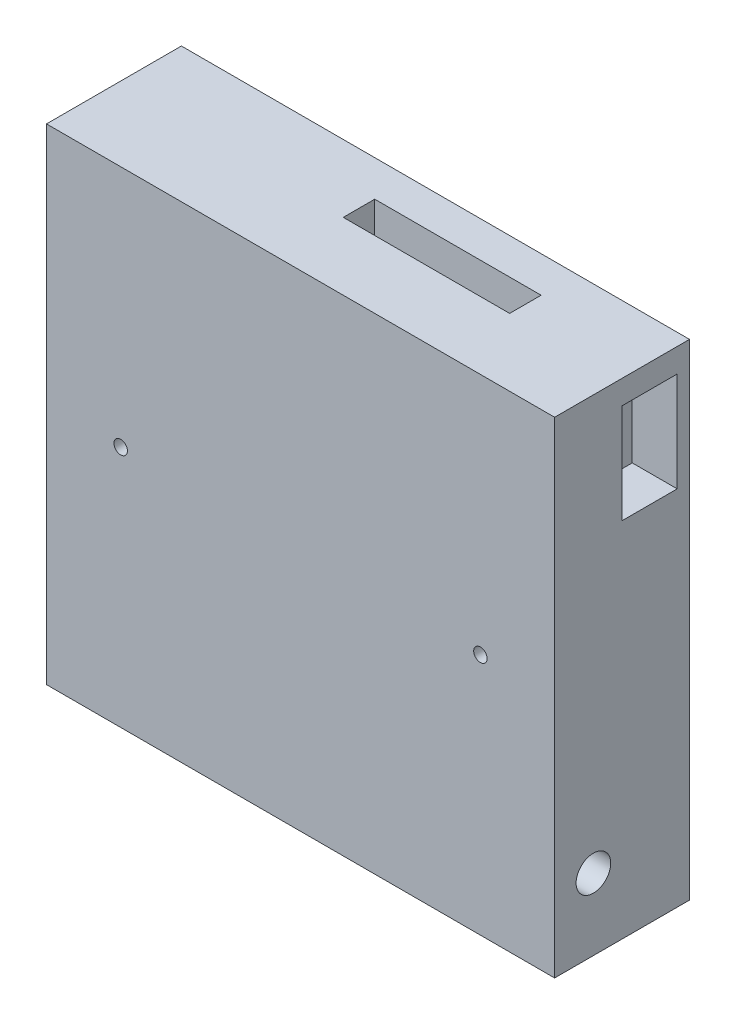
ISO-10303-21;
HEADER;
FILE_DESCRIPTION(('STEP AP214'),'2;1');
FILE_NAME('part.step','',(''),(''),'','','');
FILE_SCHEMA(('AUTOMOTIVE_DESIGN { 1 0 10303 214 1 1 1 1 }'));
ENDSEC;
DATA;
#1=APPLICATION_CONTEXT('core data for automotive mechanical design processes');
#2=APPLICATION_PROTOCOL_DEFINITION('international standard','automotive_design',2000,#1);
#3=PRODUCT_CONTEXT('',#1,'mechanical');
#4=PRODUCT('Part','Part','',(#3));
#5=PRODUCT_RELATED_PRODUCT_CATEGORY('part','',(#4));
#6=PRODUCT_DEFINITION_FORMATION('','',#4);
#7=PRODUCT_DEFINITION_CONTEXT('part definition',#1,'design');
#8=PRODUCT_DEFINITION('design','',#6,#7);
#9=PRODUCT_DEFINITION_SHAPE('','',#8);
#10=(LENGTH_UNIT() NAMED_UNIT(*) SI_UNIT(.MILLI.,.METRE.));
#11=(NAMED_UNIT(*) PLANE_ANGLE_UNIT() SI_UNIT($,.RADIAN.));
#12=(NAMED_UNIT(*) SI_UNIT($,.STERADIAN.) SOLID_ANGLE_UNIT());
#13=UNCERTAINTY_MEASURE_WITH_UNIT(LENGTH_MEASURE(1.E-05),#10,'distance_accuracy_value','');
#14=(GEOMETRIC_REPRESENTATION_CONTEXT(3) GLOBAL_UNCERTAINTY_ASSIGNED_CONTEXT((#13)) GLOBAL_UNIT_ASSIGNED_CONTEXT((#10,
#11,#12)) REPRESENTATION_CONTEXT('',''));
#15=CARTESIAN_POINT('',(0.,0.,0.));
#16=DIRECTION('',(0.,0.,1.));
#17=DIRECTION('',(1.,0.,0.));
#18=AXIS2_PLACEMENT_3D('',#15,#16,#17);
#19=CARTESIAN_POINT('',(0.,0.,-15.));
#20=DIRECTION('',(0.,0.,1.));
#21=DIRECTION('',(1.,0.,0.));
#22=AXIS2_PLACEMENT_3D('',#19,#20,#21);
#23=PLANE('',#22);
#24=CARTESIAN_POINT('',(40.5,-38.,-15.));
#25=DIRECTION('',(0.,0.,-1.));
#26=DIRECTION('',(-1.,0.,0.));
#27=AXIS2_PLACEMENT_3D('',#24,#25,#26);
#28=CIRCLE('',#27,5.);
#29=CARTESIAN_POINT('',(35.5,-38.,-15.));
#30=VERTEX_POINT('',#29);
#31=EDGE_CURVE('E20',#30,#30,#28,.F.);
#32=ORIENTED_EDGE('',*,*,#31,.F.);
#33=EDGE_LOOP('',(#32));
#34=FACE_BOUND('',#33,.T.);
#35=ADVANCED_FACE('F17',(#34),#23,.F.);
#36=CARTESIAN_POINT('',(40.5,-38.,-13.));
#37=DIRECTION('',(0.,0.,-1.));
#38=DIRECTION('',(-1.,0.,0.));
#39=AXIS2_PLACEMENT_3D('',#36,#37,#38);
#40=CYLINDRICAL_SURFACE('',#39,5.);
#41=CARTESIAN_POINT('',(40.5,-38.,-13.));
#42=DIRECTION('',(0.,0.,-1.));
#43=DIRECTION('',(-1.,0.,0.));
#44=AXIS2_PLACEMENT_3D('',#41,#42,#43);
#45=CIRCLE('',#44,5.);
#46=CARTESIAN_POINT('',(35.5,-38.,-13.));
#47=VERTEX_POINT('',#46);
#48=EDGE_CURVE('E181',#47,#47,#45,.F.);
#49=ORIENTED_EDGE('',*,*,#48,.F.);
#50=EDGE_LOOP('',(#49));
#51=FACE_BOUND('',#50,.T.);
#52=ORIENTED_EDGE('',*,*,#31,.T.);
#53=EDGE_LOOP('',(#52));
#54=FACE_BOUND('',#53,.T.);
#55=ADVANCED_FACE('F188',(#51,#54),#40,.T.);
#56=CARTESIAN_POINT('',(40.5,-38.,-13.));
#57=DIRECTION('',(0.,0.,-1.));
#58=DIRECTION('',(-1.,0.,0.));
#59=AXIS2_PLACEMENT_3D('',#56,#57,#58);
#60=PLANE('',#59);
#61=CARTESIAN_POINT('',(40.5,-38.,-13.));
#62=DIRECTION('',(0.,0.,-1.));
#63=DIRECTION('',(-1.,0.,0.));
#64=AXIS2_PLACEMENT_3D('',#61,#62,#63);
#65=CIRCLE('',#64,6.);
#66=CARTESIAN_POINT('',(34.5,-38.,-13.));
#67=VERTEX_POINT('',#66);
#68=EDGE_CURVE('E179',#67,#67,#65,.T.);
#69=ORIENTED_EDGE('',*,*,#68,.T.);
#70=EDGE_LOOP('',(#69));
#71=FACE_BOUND('',#70,.T.);
#72=ORIENTED_EDGE('',*,*,#48,.T.);
#73=EDGE_LOOP('',(#72));
#74=FACE_BOUND('',#73,.T.);
#75=ADVANCED_FACE('F195',(#71,#74),#60,.T.);
#76=CARTESIAN_POINT('',(46.5,-38.1179725269454,6.37303641617704));
#77=DIRECTION('',(1.,0.,0.));
#78=DIRECTION('',(0.,1.,0.));
#79=AXIS2_PLACEMENT_3D('',#76,#77,#78);
#80=PLANE('',#79);
#81=CARTESIAN_POINT('',(46.5,-38.1179725269454,6.37303641617704));
#82=DIRECTION('',(1.,0.,0.));
#83=DIRECTION('',(0.,1.,0.));
#84=AXIS2_PLACEMENT_3D('',#81,#82,#83);
#85=CIRCLE('',#84,3.84787104372952);
#86=CARTESIAN_POINT('',(46.5,-34.2701014832159,6.37303641617704));
#87=VERTEX_POINT('',#86);
#88=EDGE_CURVE('E138',#87,#87,#85,.T.);
#89=ORIENTED_EDGE('',*,*,#88,.T.);
#90=EDGE_LOOP('',(#89));
#91=FACE_BOUND('',#90,.T.);
#92=ADVANCED_FACE('F303',(#91),#80,.T.);
#93=CARTESIAN_POINT('',(46.5,0.,0.));
#94=DIRECTION('',(1.,0.,0.));
#95=DIRECTION('',(0.,0.,-1.));
#96=AXIS2_PLACEMENT_3D('',#93,#94,#95);
#97=PLANE('',#96);
#98=DIRECTION('',(0.,1.,0.));
#99=VECTOR('',#98,1.);
#100=CARTESIAN_POINT('',(46.5,26.5743593957575,-12.2650889518879));
#101=LINE('',#100,#99);
#102=CARTESIAN_POINT('',(46.5,26.5743593957575,-12.2650889518879));
#103=VERTEX_POINT('',#102);
#104=CARTESIAN_POINT('',(46.5,48.6996178972024,-12.2650889518879));
#105=VERTEX_POINT('',#104);
#106=EDGE_CURVE('E130',#103,#105,#101,.T.);
#107=ORIENTED_EDGE('',*,*,#106,.T.);
#108=DIRECTION('',(0.,0.,1.));
#109=VECTOR('',#108,1.);
#110=CARTESIAN_POINT('',(46.5,48.6996178972024,-12.2650889518879));
#111=LINE('',#110,#109);
#112=CARTESIAN_POINT('',(46.5,48.6996178972024,0.));
#113=VERTEX_POINT('',#112);
#114=EDGE_CURVE('E127',#105,#113,#111,.T.);
#115=ORIENTED_EDGE('',*,*,#114,.T.);
#116=DIRECTION('',(0.,1.,0.));
#117=VECTOR('',#116,1.);
#118=CARTESIAN_POINT('',(46.5,26.5743593957575,0.));
#119=LINE('',#118,#117);
#120=CARTESIAN_POINT('',(46.5,26.5743593957575,0.));
#121=VERTEX_POINT('',#120);
#122=EDGE_CURVE('E152',#113,#121,#119,.F.);
#123=ORIENTED_EDGE('',*,*,#122,.T.);
#124=DIRECTION('',(0.,0.,1.));
#125=VECTOR('',#124,1.);
#126=CARTESIAN_POINT('',(46.5,26.5743593957575,-12.2650889518879));
#127=LINE('',#126,#125);
#128=EDGE_CURVE('E134',#121,#103,#127,.F.);
#129=ORIENTED_EDGE('',*,*,#128,.T.);
#130=EDGE_LOOP('',(#107,#115,#123,#129));
#131=FACE_BOUND('',#130,.T.);
#132=ADVANCED_FACE('F132',(#131),#97,.T.);
#133=CARTESIAN_POINT('',(0.,44.,0.));
#134=DIRECTION('',(0.,-1.,0.));
#135=DIRECTION('',(0.,0.,-1.));
#136=AXIS2_PLACEMENT_3D('',#133,#134,#135);
#137=PLANE('',#136);
#138=DIRECTION('',(1.,0.,0.));
#139=VECTOR('',#138,1.);
#140=CARTESIAN_POINT('',(31.5,44.,0.));
#141=LINE('',#140,#139);
#142=CARTESIAN_POINT('',(-5.49999999999999,44.,0.));
#143=VERTEX_POINT('',#142);
#144=CARTESIAN_POINT('',(31.5,44.,0.));
#145=VERTEX_POINT('',#144);
#146=EDGE_CURVE('E536',#143,#145,#141,.T.);
#147=ORIENTED_EDGE('',*,*,#146,.T.);
#148=DIRECTION('',(0.,0.,1.));
#149=VECTOR('',#148,1.);
#150=CARTESIAN_POINT('',(31.5,44.,-7.));
#151=LINE('',#150,#149);
#152=CARTESIAN_POINT('',(31.5,44.,-7.));
#153=VERTEX_POINT('',#152);
#154=EDGE_CURVE('E538',#145,#153,#151,.F.);
#155=ORIENTED_EDGE('',*,*,#154,.T.);
#156=DIRECTION('',(-1.,0.,0.));
#157=VECTOR('',#156,1.);
#158=CARTESIAN_POINT('',(-5.49999999999999,44.,-7.));
#159=LINE('',#158,#157);
#160=CARTESIAN_POINT('',(-5.49999999999999,44.,-7.));
#161=VERTEX_POINT('',#160);
#162=EDGE_CURVE('E568',#153,#161,#159,.T.);
#163=ORIENTED_EDGE('',*,*,#162,.T.);
#164=DIRECTION('',(0.,0.,1.));
#165=VECTOR('',#164,1.);
#166=CARTESIAN_POINT('',(-5.49999999999999,44.,0.));
#167=LINE('',#166,#165);
#168=EDGE_CURVE('E541',#161,#143,#167,.T.);
#169=ORIENTED_EDGE('',*,*,#168,.T.);
#170=EDGE_LOOP('',(#147,#155,#163,#169));
#171=FACE_BOUND('',#170,.T.);
#172=ADVANCED_FACE('F296',(#171),#137,.F.);
#173=CARTESIAN_POINT('',(-46.5,0.,0.));
#174=DIRECTION('',(-1.,0.,0.));
#175=DIRECTION('',(0.,-1.,0.));
#176=AXIS2_PLACEMENT_3D('',#173,#174,#175);
#177=PLANE('',#176);
#178=DIRECTION('',(0.,-1.,0.));
#179=VECTOR('',#178,1.);
#180=CARTESIAN_POINT('',(-46.5,-45.,7.5));
#181=LINE('',#180,#179);
#182=CARTESIAN_POINT('',(-46.5,-45.,7.5));
#183=VERTEX_POINT('',#182);
#184=CARTESIAN_POINT('',(-46.5,45.,7.5));
#185=VERTEX_POINT('',#184);
#186=EDGE_CURVE('E557',#183,#185,#181,.F.);
#187=ORIENTED_EDGE('',*,*,#186,.T.);
#188=DIRECTION('',(0.,0.,1.));
#189=VECTOR('',#188,1.);
#190=CARTESIAN_POINT('',(-46.5,45.,7.5));
#191=LINE('',#190,#189);
#192=CARTESIAN_POINT('',(-46.5,45.,-7.5));
#193=VERTEX_POINT('',#192);
#194=EDGE_CURVE('E600',#185,#193,#191,.F.);
#195=ORIENTED_EDGE('',*,*,#194,.T.);
#196=DIRECTION('',(0.,1.,0.));
#197=VECTOR('',#196,1.);
#198=CARTESIAN_POINT('',(-46.5,-45.,-7.5));
#199=LINE('',#198,#197);
#200=CARTESIAN_POINT('',(-46.5,-45.,-7.5));
#201=VERTEX_POINT('',#200);
#202=EDGE_CURVE('E595',#193,#201,#199,.F.);
#203=ORIENTED_EDGE('',*,*,#202,.T.);
#204=DIRECTION('',(0.,0.,1.));
#205=VECTOR('',#204,1.);
#206=CARTESIAN_POINT('',(-46.5,-45.,7.5));
#207=LINE('',#206,#205);
#208=EDGE_CURVE('E590',#201,#183,#207,.T.);
#209=ORIENTED_EDGE('',*,*,#208,.T.);
#210=EDGE_LOOP('',(#187,#195,#203,#209));
#211=FACE_BOUND('',#210,.T.);
#212=ADVANCED_FACE('F292',(#211),#177,.T.);
#213=CARTESIAN_POINT('',(40.5,-38.,-13.));
#214=DIRECTION('',(0.,0.,-1.));
#215=DIRECTION('',(-1.,0.,0.));
#216=AXIS2_PLACEMENT_3D('',#213,#214,#215);
#217=CYLINDRICAL_SURFACE('',#216,6.);
#218=ORIENTED_EDGE('',*,*,#68,.F.);
#219=EDGE_LOOP('',(#218));
#220=FACE_BOUND('',#219,.T.);
#221=CARTESIAN_POINT('',(40.5,-38.,-15.));
#222=DIRECTION('',(0.,0.,-1.));
#223=DIRECTION('',(-1.,0.,0.));
#224=AXIS2_PLACEMENT_3D('',#221,#222,#223);
#225=CIRCLE('',#224,6.);
#226=CARTESIAN_POINT('',(34.5,-38.,-15.));
#227=VERTEX_POINT('',#226);
#228=EDGE_CURVE('E173',#227,#227,#225,.T.);
#229=ORIENTED_EDGE('',*,*,#228,.T.);
#230=EDGE_LOOP('',(#229));
#231=FACE_BOUND('',#230,.T.);
#232=ADVANCED_FACE('F288',(#220,#231),#217,.F.);
#233=CARTESIAN_POINT('',(40.,0.,5.));
#234=DIRECTION('',(0.,0.,1.));
#235=DIRECTION('',(1.,0.,0.));
#236=AXIS2_PLACEMENT_3D('',#233,#234,#235);
#237=PLANE('',#236);
#238=CARTESIAN_POINT('',(40.,0.,5.));
#239=DIRECTION('',(0.,0.,1.));
#240=DIRECTION('',(1.,0.,0.));
#241=AXIS2_PLACEMENT_3D('',#238,#239,#240);
#242=CIRCLE('',#241,1.5);
#243=CARTESIAN_POINT('',(41.5,0.,5.));
#244=VERTEX_POINT('',#243);
#245=EDGE_CURVE('E170',#244,#244,#242,.T.);
#246=ORIENTED_EDGE('',*,*,#245,.T.);
#247=EDGE_LOOP('',(#246));
#248=FACE_BOUND('',#247,.T.);
#249=ADVANCED_FACE('F284',(#248),#237,.T.);
#250=CARTESIAN_POINT('',(-40.,0.,5.));
#251=DIRECTION('',(0.,0.,1.));
#252=DIRECTION('',(1.,0.,0.));
#253=AXIS2_PLACEMENT_3D('',#250,#251,#252);
#254=PLANE('',#253);
#255=CARTESIAN_POINT('',(-40.,0.,5.));
#256=DIRECTION('',(0.,0.,1.));
#257=DIRECTION('',(1.,0.,0.));
#258=AXIS2_PLACEMENT_3D('',#255,#256,#257);
#259=CIRCLE('',#258,1.5);
#260=CARTESIAN_POINT('',(-38.5,0.,5.));
#261=VERTEX_POINT('',#260);
#262=EDGE_CURVE('E167',#261,#261,#259,.T.);
#263=ORIENTED_EDGE('',*,*,#262,.T.);
#264=EDGE_LOOP('',(#263));
#265=FACE_BOUND('',#264,.T.);
#266=ADVANCED_FACE('F280',(#265),#254,.T.);
#267=CARTESIAN_POINT('',(46.5,-38.1179725269454,6.37303641617704));
#268=DIRECTION('',(1.,0.,0.));
#269=DIRECTION('',(0.,1.,0.));
#270=AXIS2_PLACEMENT_3D('',#267,#268,#269);
#271=CYLINDRICAL_SURFACE('',#270,3.84787104372952);
#272=ORIENTED_EDGE('',*,*,#88,.F.);
#273=EDGE_LOOP('',(#272));
#274=FACE_BOUND('',#273,.T.);
#275=CARTESIAN_POINT('',(56.5,-38.1179725269454,6.37303641617704));
#276=DIRECTION('',(1.,0.,0.));
#277=DIRECTION('',(0.,1.,0.));
#278=AXIS2_PLACEMENT_3D('',#275,#276,#277);
#279=CIRCLE('',#278,3.84787104372952);
#280=CARTESIAN_POINT('',(56.5,-34.2701014832159,6.37303641617704));
#281=VERTEX_POINT('',#280);
#282=EDGE_CURVE('E164',#281,#281,#279,.T.);
#283=ORIENTED_EDGE('',*,*,#282,.T.);
#284=EDGE_LOOP('',(#283));
#285=FACE_BOUND('',#284,.T.);
#286=ADVANCED_FACE('F277',(#274,#285),#271,.F.);
#287=CARTESIAN_POINT('',(46.5,26.5743593957575,-12.2650889518879));
#288=DIRECTION('',(0.,0.,-1.));
#289=DIRECTION('',(-1.,0.,0.));
#290=AXIS2_PLACEMENT_3D('',#287,#288,#289);
#291=PLANE('',#290);
#292=DIRECTION('',(-1.,0.,0.));
#293=VECTOR('',#292,1.);
#294=CARTESIAN_POINT('',(46.5,48.6996178972024,-12.2650889518879));
#295=LINE('',#294,#293);
#296=CARTESIAN_POINT('',(56.5,48.6996178972024,-12.2650889518879));
#297=VERTEX_POINT('',#296);
#298=EDGE_CURVE('E137',#297,#105,#295,.T.);
#299=ORIENTED_EDGE('',*,*,#298,.T.);
#300=ORIENTED_EDGE('',*,*,#106,.F.);
#301=DIRECTION('',(1.,0.,0.));
#302=VECTOR('',#301,1.);
#303=CARTESIAN_POINT('',(46.5,26.5743593957575,-12.2650889518879));
#304=LINE('',#303,#302);
#305=CARTESIAN_POINT('',(56.5,26.5743593957575,-12.2650889518879));
#306=VERTEX_POINT('',#305);
#307=EDGE_CURVE('E552',#103,#306,#304,.T.);
#308=ORIENTED_EDGE('',*,*,#307,.T.);
#309=DIRECTION('',(0.,-1.,0.));
#310=VECTOR('',#309,1.);
#311=CARTESIAN_POINT('',(56.5,54.,-12.2650889518879));
#312=LINE('',#311,#310);
#313=EDGE_CURVE('E143',#306,#297,#312,.F.);
#314=ORIENTED_EDGE('',*,*,#313,.T.);
#315=EDGE_LOOP('',(#299,#300,#308,#314));
#316=FACE_BOUND('',#315,.T.);
#317=ADVANCED_FACE('F141',(#316),#291,.F.);
#318=CARTESIAN_POINT('',(46.5,48.6996178972024,-12.2650889518879));
#319=DIRECTION('',(0.,1.,0.));
#320=DIRECTION('',(-1.,0.,0.));
#321=AXIS2_PLACEMENT_3D('',#318,#319,#320);
#322=PLANE('',#321);
#323=DIRECTION('',(1.,0.,0.));
#324=VECTOR('',#323,1.);
#325=CARTESIAN_POINT('',(46.5,48.6996178972024,0.));
#326=LINE('',#325,#324);
#327=CARTESIAN_POINT('',(56.5,48.6996178972024,0.));
#328=VERTEX_POINT('',#327);
#329=EDGE_CURVE('E149',#328,#113,#326,.F.);
#330=ORIENTED_EDGE('',*,*,#329,.T.);
#331=ORIENTED_EDGE('',*,*,#114,.F.);
#332=ORIENTED_EDGE('',*,*,#298,.F.);
#333=DIRECTION('',(0.,0.,1.));
#334=VECTOR('',#333,1.);
#335=CARTESIAN_POINT('',(56.5,48.6996178972024,15.));
#336=LINE('',#335,#334);
#337=EDGE_CURVE('E584',#297,#328,#336,.T.);
#338=ORIENTED_EDGE('',*,*,#337,.T.);
#339=EDGE_LOOP('',(#330,#331,#332,#338));
#340=FACE_BOUND('',#339,.T.);
#341=ADVANCED_FACE('F147',(#340),#322,.F.);
#342=CARTESIAN_POINT('',(46.5,26.5743593957575,0.));
#343=DIRECTION('',(0.,0.,1.));
#344=DIRECTION('',(1.,0.,0.));
#345=AXIS2_PLACEMENT_3D('',#342,#343,#344);
#346=PLANE('',#345);
#347=DIRECTION('',(1.,0.,0.));
#348=VECTOR('',#347,1.);
#349=CARTESIAN_POINT('',(46.5,26.5743593957575,0.));
#350=LINE('',#349,#348);
#351=CARTESIAN_POINT('',(56.5,26.5743593957575,0.));
#352=VERTEX_POINT('',#351);
#353=EDGE_CURVE('E573',#352,#121,#350,.F.);
#354=ORIENTED_EDGE('',*,*,#353,.T.);
#355=ORIENTED_EDGE('',*,*,#122,.F.);
#356=ORIENTED_EDGE('',*,*,#329,.F.);
#357=DIRECTION('',(0.,-1.,0.));
#358=VECTOR('',#357,1.);
#359=CARTESIAN_POINT('',(56.5,54.,0.));
#360=LINE('',#359,#358);
#361=EDGE_CURVE('E577',#328,#352,#360,.T.);
#362=ORIENTED_EDGE('',*,*,#361,.T.);
#363=EDGE_LOOP('',(#354,#355,#356,#362));
#364=FACE_BOUND('',#363,.T.);
#365=ADVANCED_FACE('F268',(#364),#346,.F.);
#366=CARTESIAN_POINT('',(46.5,26.5743593957575,-12.2650889518879));
#367=DIRECTION('',(0.,-1.,0.));
#368=DIRECTION('',(1.,0.,0.));
#369=AXIS2_PLACEMENT_3D('',#366,#367,#368);
#370=PLANE('',#369);
#371=ORIENTED_EDGE('',*,*,#307,.F.);
#372=ORIENTED_EDGE('',*,*,#128,.F.);
#373=ORIENTED_EDGE('',*,*,#353,.F.);
#374=DIRECTION('',(0.,0.,1.));
#375=VECTOR('',#374,1.);
#376=CARTESIAN_POINT('',(56.5,26.5743593957575,15.));
#377=LINE('',#376,#375);
#378=EDGE_CURVE('E580',#352,#306,#377,.F.);
#379=ORIENTED_EDGE('',*,*,#378,.T.);
#380=EDGE_LOOP('',(#371,#372,#373,#379));
#381=FACE_BOUND('',#380,.T.);
#382=ADVANCED_FACE('F264',(#381),#370,.F.);
#383=CARTESIAN_POINT('',(31.5,44.,-7.));
#384=DIRECTION('',(1.,0.,0.));
#385=DIRECTION('',(0.,1.,0.));
#386=AXIS2_PLACEMENT_3D('',#383,#384,#385);
#387=PLANE('',#386);
#388=DIRECTION('',(0.,1.,0.));
#389=VECTOR('',#388,1.);
#390=CARTESIAN_POINT('',(31.5,44.,-7.));
#391=LINE('',#390,#389);
#392=CARTESIAN_POINT('',(31.5,54.,-7.));
#393=VERTEX_POINT('',#392);
#394=EDGE_CURVE('E550',#393,#153,#391,.F.);
#395=ORIENTED_EDGE('',*,*,#394,.T.);
#396=ORIENTED_EDGE('',*,*,#154,.F.);
#397=DIRECTION('',(0.,1.,0.));
#398=VECTOR('',#397,1.);
#399=CARTESIAN_POINT('',(31.5,44.,0.));
#400=LINE('',#399,#398);
#401=CARTESIAN_POINT('',(31.5,54.,0.));
#402=VERTEX_POINT('',#401);
#403=EDGE_CURVE('E545',#145,#402,#400,.T.);
#404=ORIENTED_EDGE('',*,*,#403,.T.);
#405=DIRECTION('',(0.,0.,1.));
#406=VECTOR('',#405,1.);
#407=CARTESIAN_POINT('',(31.5,54.,15.));
#408=LINE('',#407,#406);
#409=EDGE_CURVE('E636',#402,#393,#408,.F.);
#410=ORIENTED_EDGE('',*,*,#409,.T.);
#411=EDGE_LOOP('',(#395,#396,#404,#410));
#412=FACE_BOUND('',#411,.T.);
#413=ADVANCED_FACE('F260',(#412),#387,.F.);
#414=CARTESIAN_POINT('',(-5.49999999999999,44.,-7.));
#415=DIRECTION('',(0.,0.,-1.));
#416=DIRECTION('',(-1.,0.,0.));
#417=AXIS2_PLACEMENT_3D('',#414,#415,#416);
#418=PLANE('',#417);
#419=DIRECTION('',(0.,-1.,0.));
#420=VECTOR('',#419,1.);
#421=CARTESIAN_POINT('',(-5.49999999999999,44.,-7.));
#422=LINE('',#421,#420);
#423=CARTESIAN_POINT('',(-5.49999999999999,54.,-7.));
#424=VERTEX_POINT('',#423);
#425=EDGE_CURVE('E565',#424,#161,#422,.T.);
#426=ORIENTED_EDGE('',*,*,#425,.T.);
#427=ORIENTED_EDGE('',*,*,#162,.F.);
#428=ORIENTED_EDGE('',*,*,#394,.F.);
#429=DIRECTION('',(1.,0.,0.));
#430=VECTOR('',#429,1.);
#431=CARTESIAN_POINT('',(-56.5,54.,-7.));
#432=LINE('',#431,#430);
#433=EDGE_CURVE('E634',#393,#424,#432,.F.);
#434=ORIENTED_EDGE('',*,*,#433,.T.);
#435=EDGE_LOOP('',(#426,#427,#428,#434));
#436=FACE_BOUND('',#435,.T.);
#437=ADVANCED_FACE('F256',(#436),#418,.F.);
#438=CARTESIAN_POINT('',(-5.49999999999999,44.,0.));
#439=DIRECTION('',(-1.,0.,0.));
#440=DIRECTION('',(0.,-1.,0.));
#441=AXIS2_PLACEMENT_3D('',#438,#439,#440);
#442=PLANE('',#441);
#443=DIRECTION('',(0.,1.,0.));
#444=VECTOR('',#443,1.);
#445=CARTESIAN_POINT('',(-5.49999999999998,44.,0.));
#446=LINE('',#445,#444);
#447=CARTESIAN_POINT('',(-5.49999999999999,54.,0.));
#448=VERTEX_POINT('',#447);
#449=EDGE_CURVE('E546',#448,#143,#446,.F.);
#450=ORIENTED_EDGE('',*,*,#449,.T.);
#451=ORIENTED_EDGE('',*,*,#168,.F.);
#452=ORIENTED_EDGE('',*,*,#425,.F.);
#453=DIRECTION('',(0.,0.,1.));
#454=VECTOR('',#453,1.);
#455=CARTESIAN_POINT('',(-5.49999999999999,54.,15.));
#456=LINE('',#455,#454);
#457=EDGE_CURVE('E632',#424,#448,#456,.T.);
#458=ORIENTED_EDGE('',*,*,#457,.T.);
#459=EDGE_LOOP('',(#450,#451,#452,#458));
#460=FACE_BOUND('',#459,.T.);
#461=ADVANCED_FACE('F252',(#460),#442,.F.);
#462=CARTESIAN_POINT('',(31.5,44.,0.));
#463=DIRECTION('',(0.,0.,1.));
#464=DIRECTION('',(1.,0.,0.));
#465=AXIS2_PLACEMENT_3D('',#462,#463,#464);
#466=PLANE('',#465);
#467=ORIENTED_EDGE('',*,*,#403,.F.);
#468=ORIENTED_EDGE('',*,*,#146,.F.);
#469=ORIENTED_EDGE('',*,*,#449,.F.);
#470=DIRECTION('',(1.,0.,0.));
#471=VECTOR('',#470,1.);
#472=CARTESIAN_POINT('',(-56.5,54.,0.));
#473=LINE('',#472,#471);
#474=EDGE_CURVE('E555',#448,#402,#473,.T.);
#475=ORIENTED_EDGE('',*,*,#474,.T.);
#476=EDGE_LOOP('',(#467,#468,#469,#475));
#477=FACE_BOUND('',#476,.T.);
#478=ADVANCED_FACE('F248',(#477),#466,.F.);
#479=CARTESIAN_POINT('',(-46.5,-45.,7.5));
#480=DIRECTION('',(0.,0.,1.));
#481=DIRECTION('',(0.,-1.,0.));
#482=AXIS2_PLACEMENT_3D('',#479,#480,#481);
#483=PLANE('',#482);
#484=DIRECTION('',(1.,0.,0.));
#485=VECTOR('',#484,1.);
#486=CARTESIAN_POINT('',(-46.5,45.,7.5));
#487=LINE('',#486,#485);
#488=CARTESIAN_POINT('',(-56.5,45.,7.5));
#489=VERTEX_POINT('',#488);
#490=EDGE_CURVE('E559',#489,#185,#487,.T.);
#491=ORIENTED_EDGE('',*,*,#490,.T.);
#492=ORIENTED_EDGE('',*,*,#186,.F.);
#493=DIRECTION('',(1.,0.,0.));
#494=VECTOR('',#493,1.);
#495=CARTESIAN_POINT('',(-46.5,-45.,7.5));
#496=LINE('',#495,#494);
#497=CARTESIAN_POINT('',(-56.5,-45.,7.5));
#498=VERTEX_POINT('',#497);
#499=EDGE_CURVE('E176',#183,#498,#496,.F.);
#500=ORIENTED_EDGE('',*,*,#499,.T.);
#501=DIRECTION('',(0.,1.,0.));
#502=VECTOR('',#501,1.);
#503=CARTESIAN_POINT('',(-56.5,54.,7.5));
#504=LINE('',#503,#502);
#505=EDGE_CURVE('E607',#498,#489,#504,.T.);
#506=ORIENTED_EDGE('',*,*,#505,.T.);
#507=EDGE_LOOP('',(#491,#492,#500,#506));
#508=FACE_BOUND('',#507,.T.);
#509=ADVANCED_FACE('F244',(#508),#483,.F.);
#510=CARTESIAN_POINT('',(-46.5,45.,7.5));
#511=DIRECTION('',(0.,1.,0.));
#512=DIRECTION('',(0.,0.,1.));
#513=AXIS2_PLACEMENT_3D('',#510,#511,#512);
#514=PLANE('',#513);
#515=DIRECTION('',(-1.,0.,0.));
#516=VECTOR('',#515,1.);
#517=CARTESIAN_POINT('',(-46.5,45.,-7.5));
#518=LINE('',#517,#516);
#519=CARTESIAN_POINT('',(-56.5,45.,-7.5));
#520=VERTEX_POINT('',#519);
#521=EDGE_CURVE('E597',#520,#193,#518,.F.);
#522=ORIENTED_EDGE('',*,*,#521,.T.);
#523=ORIENTED_EDGE('',*,*,#194,.F.);
#524=ORIENTED_EDGE('',*,*,#490,.F.);
#525=DIRECTION('',(0.,0.,1.));
#526=VECTOR('',#525,1.);
#527=CARTESIAN_POINT('',(-56.5,45.,15.));
#528=LINE('',#527,#526);
#529=EDGE_CURVE('E621',#489,#520,#528,.F.);
#530=ORIENTED_EDGE('',*,*,#529,.T.);
#531=EDGE_LOOP('',(#522,#523,#524,#530));
#532=FACE_BOUND('',#531,.T.);
#533=ADVANCED_FACE('F240',(#532),#514,.F.);
#534=CARTESIAN_POINT('',(-46.5,-45.,-7.5));
#535=DIRECTION('',(0.,0.,-1.));
#536=DIRECTION('',(-1.,0.,0.));
#537=AXIS2_PLACEMENT_3D('',#534,#535,#536);
#538=PLANE('',#537);
#539=DIRECTION('',(1.,0.,0.));
#540=VECTOR('',#539,1.);
#541=CARTESIAN_POINT('',(-46.5,-45.,-7.5));
#542=LINE('',#541,#540);
#543=CARTESIAN_POINT('',(-56.5,-45.,-7.5));
#544=VERTEX_POINT('',#543);
#545=EDGE_CURVE('E592',#544,#201,#542,.T.);
#546=ORIENTED_EDGE('',*,*,#545,.T.);
#547=ORIENTED_EDGE('',*,*,#202,.F.);
#548=ORIENTED_EDGE('',*,*,#521,.F.);
#549=DIRECTION('',(0.,1.,0.));
#550=VECTOR('',#549,1.);
#551=CARTESIAN_POINT('',(-56.5,54.,-7.5));
#552=LINE('',#551,#550);
#553=EDGE_CURVE('E619',#520,#544,#552,.F.);
#554=ORIENTED_EDGE('',*,*,#553,.T.);
#555=EDGE_LOOP('',(#546,#547,#548,#554));
#556=FACE_BOUND('',#555,.T.);
#557=ADVANCED_FACE('F236',(#556),#538,.F.);
#558=CARTESIAN_POINT('',(-46.5,-45.,7.5));
#559=DIRECTION('',(0.,-1.,0.));
#560=DIRECTION('',(1.,0.,0.));
#561=AXIS2_PLACEMENT_3D('',#558,#559,#560);
#562=PLANE('',#561);
#563=ORIENTED_EDGE('',*,*,#499,.F.);
#564=ORIENTED_EDGE('',*,*,#208,.F.);
#565=ORIENTED_EDGE('',*,*,#545,.F.);
#566=DIRECTION('',(0.,0.,1.));
#567=VECTOR('',#566,1.);
#568=CARTESIAN_POINT('',(-56.5,-45.,15.));
#569=LINE('',#568,#567);
#570=EDGE_CURVE('E615',#544,#498,#569,.T.);
#571=ORIENTED_EDGE('',*,*,#570,.T.);
#572=EDGE_LOOP('',(#563,#564,#565,#571));
#573=FACE_BOUND('',#572,.T.);
#574=ADVANCED_FACE('F232',(#573),#562,.F.);
#575=CARTESIAN_POINT('',(0.,0.,-15.));
#576=DIRECTION('',(0.,0.,1.));
#577=DIRECTION('',(1.,0.,0.));
#578=AXIS2_PLACEMENT_3D('',#575,#576,#577);
#579=PLANE('',#578);
#580=DIRECTION('',(-1.,0.,0.));
#581=VECTOR('',#580,1.);
#582=CARTESIAN_POINT('',(-56.5,-54.,-15.));
#583=LINE('',#582,#581);
#584=CARTESIAN_POINT('',(56.5,-54.,-15.));
#585=VERTEX_POINT('',#584);
#586=CARTESIAN_POINT('',(-56.5,-54.,-15.));
#587=VERTEX_POINT('',#586);
#588=EDGE_CURVE('E163',#585,#587,#583,.T.);
#589=ORIENTED_EDGE('',*,*,#588,.T.);
#590=DIRECTION('',(0.,1.,0.));
#591=VECTOR('',#590,1.);
#592=CARTESIAN_POINT('',(-56.5,54.,-15.));
#593=LINE('',#592,#591);
#594=CARTESIAN_POINT('',(-56.5,54.,-15.));
#595=VERTEX_POINT('',#594);
#596=EDGE_CURVE('E652',#587,#595,#593,.T.);
#597=ORIENTED_EDGE('',*,*,#596,.T.);
#598=DIRECTION('',(1.,0.,0.));
#599=VECTOR('',#598,1.);
#600=CARTESIAN_POINT('',(-56.5,54.,-15.));
#601=LINE('',#600,#599);
#602=CARTESIAN_POINT('',(56.5,54.,-15.));
#603=VERTEX_POINT('',#602);
#604=EDGE_CURVE('E622',#595,#603,#601,.T.);
#605=ORIENTED_EDGE('',*,*,#604,.T.);
#606=DIRECTION('',(0.,-1.,0.));
#607=VECTOR('',#606,1.);
#608=CARTESIAN_POINT('',(56.5,54.,-15.));
#609=LINE('',#608,#607);
#610=EDGE_CURVE('E582',#603,#585,#609,.T.);
#611=ORIENTED_EDGE('',*,*,#610,.T.);
#612=EDGE_LOOP('',(#589,#597,#605,#611));
#613=FACE_BOUND('',#612,.T.);
#614=ORIENTED_EDGE('',*,*,#228,.F.);
#615=EDGE_LOOP('',(#614));
#616=FACE_BOUND('',#615,.T.);
#617=ADVANCED_FACE('F228',(#613,#616),#579,.F.);
#618=CARTESIAN_POINT('',(40.,0.,5.));
#619=DIRECTION('',(0.,0.,1.));
#620=DIRECTION('',(1.,0.,0.));
#621=AXIS2_PLACEMENT_3D('',#618,#619,#620);
#622=CYLINDRICAL_SURFACE('',#621,1.5);
#623=CARTESIAN_POINT('',(40.,0.,15.));
#624=DIRECTION('',(0.,0.,1.));
#625=DIRECTION('',(1.,0.,0.));
#626=AXIS2_PLACEMENT_3D('',#623,#624,#625);
#627=CIRCLE('',#626,1.5);
#628=CARTESIAN_POINT('',(41.5,0.,15.));
#629=VERTEX_POINT('',#628);
#630=EDGE_CURVE('E160',#629,#629,#627,.F.);
#631=ORIENTED_EDGE('',*,*,#630,.F.);
#632=EDGE_LOOP('',(#631));
#633=FACE_BOUND('',#632,.T.);
#634=ORIENTED_EDGE('',*,*,#245,.F.);
#635=EDGE_LOOP('',(#634));
#636=FACE_BOUND('',#635,.T.);
#637=ADVANCED_FACE('F224',(#633,#636),#622,.F.);
#638=CARTESIAN_POINT('',(-40.,0.,5.));
#639=DIRECTION('',(0.,0.,1.));
#640=DIRECTION('',(1.,0.,0.));
#641=AXIS2_PLACEMENT_3D('',#638,#639,#640);
#642=CYLINDRICAL_SURFACE('',#641,1.5);
#643=CARTESIAN_POINT('',(-40.,0.,15.));
#644=DIRECTION('',(0.,0.,1.));
#645=DIRECTION('',(1.,0.,0.));
#646=AXIS2_PLACEMENT_3D('',#643,#644,#645);
#647=CIRCLE('',#646,1.5);
#648=CARTESIAN_POINT('',(-38.5,0.,15.));
#649=VERTEX_POINT('',#648);
#650=EDGE_CURVE('E156',#649,#649,#647,.F.);
#651=ORIENTED_EDGE('',*,*,#650,.F.);
#652=EDGE_LOOP('',(#651));
#653=FACE_BOUND('',#652,.T.);
#654=ORIENTED_EDGE('',*,*,#262,.F.);
#655=EDGE_LOOP('',(#654));
#656=FACE_BOUND('',#655,.T.);
#657=ADVANCED_FACE('F220',(#653,#656),#642,.F.);
#658=CARTESIAN_POINT('',(56.5,54.,15.));
#659=DIRECTION('',(-1.,0.,0.));
#660=DIRECTION('',(0.,-1.,0.));
#661=AXIS2_PLACEMENT_3D('',#658,#659,#660);
#662=PLANE('',#661);
#663=DIRECTION('',(0.,0.,1.));
#664=VECTOR('',#663,1.);
#665=CARTESIAN_POINT('',(56.5,54.,15.));
#666=LINE('',#665,#664);
#667=CARTESIAN_POINT('',(56.5,54.,15.));
#668=VERTEX_POINT('',#667);
#669=EDGE_CURVE('E626',#603,#668,#666,.T.);
#670=ORIENTED_EDGE('',*,*,#669,.T.);
#671=DIRECTION('',(0.,1.,0.));
#672=VECTOR('',#671,1.);
#673=CARTESIAN_POINT('',(56.5,0.,15.));
#674=LINE('',#673,#672);
#675=CARTESIAN_POINT('',(56.5,-54.,15.));
#676=VERTEX_POINT('',#675);
#677=EDGE_CURVE('E159',#676,#668,#674,.T.);
#678=ORIENTED_EDGE('',*,*,#677,.F.);
#679=DIRECTION('',(0.,0.,1.));
#680=VECTOR('',#679,1.);
#681=CARTESIAN_POINT('',(56.5,-54.,15.));
#682=LINE('',#681,#680);
#683=EDGE_CURVE('E644',#676,#585,#682,.F.);
#684=ORIENTED_EDGE('',*,*,#683,.T.);
#685=ORIENTED_EDGE('',*,*,#610,.F.);
#686=EDGE_LOOP('',(#670,#678,#684,#685));
#687=FACE_BOUND('',#686,.T.);
#688=ORIENTED_EDGE('',*,*,#361,.F.);
#689=ORIENTED_EDGE('',*,*,#337,.F.);
#690=ORIENTED_EDGE('',*,*,#313,.F.);
#691=ORIENTED_EDGE('',*,*,#378,.F.);
#692=EDGE_LOOP('',(#688,#689,#690,#691));
#693=FACE_BOUND('',#692,.T.);
#694=ORIENTED_EDGE('',*,*,#282,.F.);
#695=EDGE_LOOP('',(#694));
#696=FACE_BOUND('',#695,.T.);
#697=ADVANCED_FACE('F216',(#687,#693,#696),#662,.F.);
#698=CARTESIAN_POINT('',(-56.5,54.,15.));
#699=DIRECTION('',(0.,-1.,0.));
#700=DIRECTION('',(1.,0.,0.));
#701=AXIS2_PLACEMENT_3D('',#698,#699,#700);
#702=PLANE('',#701);
#703=DIRECTION('',(0.,0.,1.));
#704=VECTOR('',#703,1.);
#705=CARTESIAN_POINT('',(-56.5,54.,15.));
#706=LINE('',#705,#704);
#707=CARTESIAN_POINT('',(-56.5,54.,15.));
#708=VERTEX_POINT('',#707);
#709=EDGE_CURVE('E618',#595,#708,#706,.T.);
#710=ORIENTED_EDGE('',*,*,#709,.T.);
#711=DIRECTION('',(1.,0.,0.));
#712=VECTOR('',#711,1.);
#713=CARTESIAN_POINT('',(0.,54.,15.));
#714=LINE('',#713,#712);
#715=EDGE_CURVE('E658',#668,#708,#714,.F.);
#716=ORIENTED_EDGE('',*,*,#715,.F.);
#717=ORIENTED_EDGE('',*,*,#669,.F.);
#718=ORIENTED_EDGE('',*,*,#604,.F.);
#719=EDGE_LOOP('',(#710,#716,#717,#718));
#720=FACE_BOUND('',#719,.T.);
#721=ORIENTED_EDGE('',*,*,#457,.F.);
#722=ORIENTED_EDGE('',*,*,#433,.F.);
#723=ORIENTED_EDGE('',*,*,#409,.F.);
#724=ORIENTED_EDGE('',*,*,#474,.F.);
#725=EDGE_LOOP('',(#721,#722,#723,#724));
#726=FACE_BOUND('',#725,.T.);
#727=ADVANCED_FACE('F213',(#720,#726),#702,.F.);
#728=CARTESIAN_POINT('',(-56.5,54.,15.));
#729=DIRECTION('',(1.,0.,0.));
#730=DIRECTION('',(0.,1.,0.));
#731=AXIS2_PLACEMENT_3D('',#728,#729,#730);
#732=PLANE('',#731);
#733=DIRECTION('',(0.,0.,1.));
#734=VECTOR('',#733,1.);
#735=CARTESIAN_POINT('',(-56.5,-54.,15.));
#736=LINE('',#735,#734);
#737=CARTESIAN_POINT('',(-56.5,-54.,15.));
#738=VERTEX_POINT('',#737);
#739=EDGE_CURVE('E35',#587,#738,#736,.T.);
#740=ORIENTED_EDGE('',*,*,#739,.T.);
#741=DIRECTION('',(0.,1.,0.));
#742=VECTOR('',#741,1.);
#743=CARTESIAN_POINT('',(-56.5,0.,15.));
#744=LINE('',#743,#742);
#745=EDGE_CURVE('E26',#708,#738,#744,.F.);
#746=ORIENTED_EDGE('',*,*,#745,.F.);
#747=ORIENTED_EDGE('',*,*,#709,.F.);
#748=ORIENTED_EDGE('',*,*,#596,.F.);
#749=EDGE_LOOP('',(#740,#746,#747,#748));
#750=FACE_BOUND('',#749,.T.);
#751=ORIENTED_EDGE('',*,*,#553,.F.);
#752=ORIENTED_EDGE('',*,*,#529,.F.);
#753=ORIENTED_EDGE('',*,*,#505,.F.);
#754=ORIENTED_EDGE('',*,*,#570,.F.);
#755=EDGE_LOOP('',(#751,#752,#753,#754));
#756=FACE_BOUND('',#755,.T.);
#757=ADVANCED_FACE('F205',(#750,#756),#732,.F.);
#758=CARTESIAN_POINT('',(-56.5,-54.,15.));
#759=DIRECTION('',(0.,1.,0.));
#760=DIRECTION('',(-1.,0.,0.));
#761=AXIS2_PLACEMENT_3D('',#758,#759,#760);
#762=PLANE('',#761);
#763=ORIENTED_EDGE('',*,*,#683,.F.);
#764=DIRECTION('',(1.,0.,0.));
#765=VECTOR('',#764,1.);
#766=CARTESIAN_POINT('',(0.,-54.,15.));
#767=LINE('',#766,#765);
#768=EDGE_CURVE('E11',#738,#676,#767,.T.);
#769=ORIENTED_EDGE('',*,*,#768,.F.);
#770=ORIENTED_EDGE('',*,*,#739,.F.);
#771=ORIENTED_EDGE('',*,*,#588,.F.);
#772=EDGE_LOOP('',(#763,#769,#770,#771));
#773=FACE_BOUND('',#772,.T.);
#774=ADVANCED_FACE('F199',(#773),#762,.F.);
#775=CARTESIAN_POINT('',(0.,0.,15.));
#776=DIRECTION('',(0.,0.,1.));
#777=DIRECTION('',(1.,0.,0.));
#778=AXIS2_PLACEMENT_3D('',#775,#776,#777);
#779=PLANE('',#778);
#780=ORIENTED_EDGE('',*,*,#745,.T.);
#781=ORIENTED_EDGE('',*,*,#768,.T.);
#782=ORIENTED_EDGE('',*,*,#677,.T.);
#783=ORIENTED_EDGE('',*,*,#715,.T.);
#784=EDGE_LOOP('',(#780,#781,#782,#783));
#785=FACE_BOUND('',#784,.T.);
#786=ORIENTED_EDGE('',*,*,#650,.T.);
#787=EDGE_LOOP('',(#786));
#788=FACE_BOUND('',#787,.T.);
#789=ORIENTED_EDGE('',*,*,#630,.T.);
#790=EDGE_LOOP('',(#789));
#791=FACE_BOUND('',#790,.T.);
#792=ADVANCED_FACE('F197',(#785,#788,#791),#779,.T.);
#793=CLOSED_SHELL('',(#35,#55,#75,#92,#132,#172,#212,#232,#249,#266,#286,#317,#341,#365,#382,
#413,#437,#461,#478,#509,#533,#557,#574,#617,#637,#657,#697,#727,#757,#774,#792));
#794=MANIFOLD_SOLID_BREP('B1',#793);
#795=ADVANCED_BREP_SHAPE_REPRESENTATION('',(#18,#794),#14);
#796=SHAPE_DEFINITION_REPRESENTATION(#9,#795);
ENDSEC;
END-ISO-10303-21;
